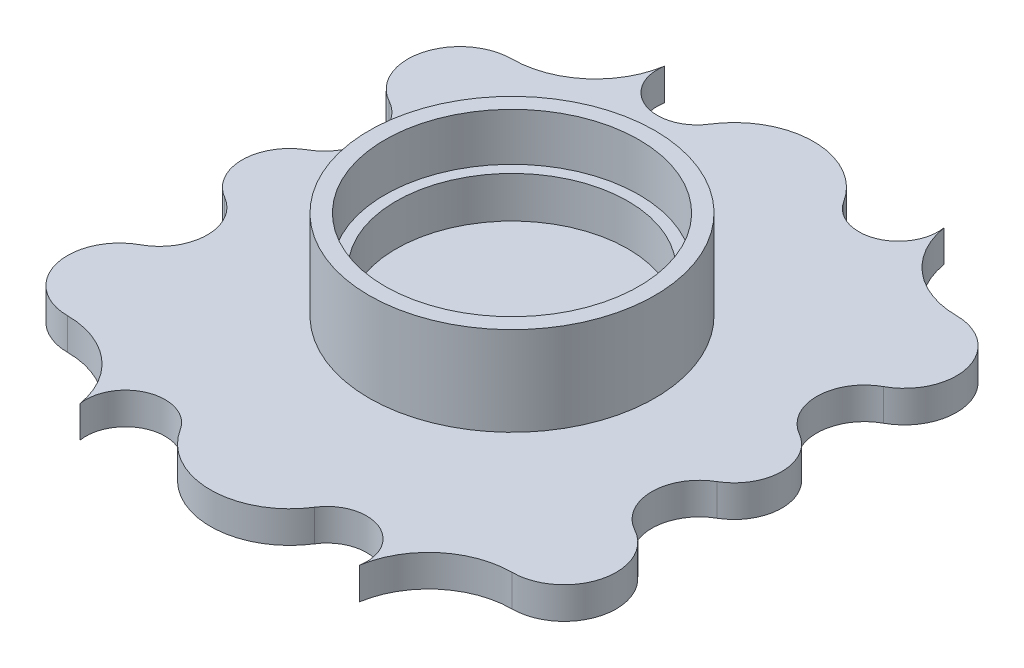
ISO-10303-21;
HEADER;
FILE_DESCRIPTION(('STEP AP214'),'2;1');
FILE_NAME('part.step','',(''),(''),'','','');
FILE_SCHEMA(('AUTOMOTIVE_DESIGN { 1 0 10303 214 1 1 1 1 }'));
ENDSEC;
DATA;
#1=APPLICATION_CONTEXT('core data for automotive mechanical design processes');
#2=APPLICATION_PROTOCOL_DEFINITION('international standard','automotive_design',2000,#1);
#3=PRODUCT_CONTEXT('',#1,'mechanical');
#4=PRODUCT('Part','Part','',(#3));
#5=PRODUCT_RELATED_PRODUCT_CATEGORY('part','',(#4));
#6=PRODUCT_DEFINITION_FORMATION('','',#4);
#7=PRODUCT_DEFINITION_CONTEXT('part definition',#1,'design');
#8=PRODUCT_DEFINITION('design','',#6,#7);
#9=PRODUCT_DEFINITION_SHAPE('','',#8);
#10=(LENGTH_UNIT() NAMED_UNIT(*) SI_UNIT(.MILLI.,.METRE.));
#11=(NAMED_UNIT(*) PLANE_ANGLE_UNIT() SI_UNIT($,.RADIAN.));
#12=(NAMED_UNIT(*) SI_UNIT($,.STERADIAN.) SOLID_ANGLE_UNIT());
#13=UNCERTAINTY_MEASURE_WITH_UNIT(LENGTH_MEASURE(1.E-05),#10,'distance_accuracy_value','');
#14=(GEOMETRIC_REPRESENTATION_CONTEXT(3) GLOBAL_UNCERTAINTY_ASSIGNED_CONTEXT((#13)) GLOBAL_UNIT_ASSIGNED_CONTEXT((#10,
#11,#12)) REPRESENTATION_CONTEXT('',''));
#15=CARTESIAN_POINT('',(0.,0.,0.));
#16=DIRECTION('',(0.,0.,1.));
#17=DIRECTION('',(1.,0.,0.));
#18=AXIS2_PLACEMENT_3D('',#15,#16,#17);
#19=CARTESIAN_POINT('',(70.,10.,-96.2922747821949));
#20=DIRECTION('',(0.,1.,0.));
#21=DIRECTION('',(0.,0.,1.));
#22=AXIS2_PLACEMENT_3D('',#19,#20,#21);
#23=PLANE('',#22);
#24=CARTESIAN_POINT('',(70.,10.,-96.2922747821949));
#25=DIRECTION('',(0.,-1.,0.));
#26=DIRECTION('',(0.,0.,1.));
#27=AXIS2_PLACEMENT_3D('',#24,#25,#26);
#28=CIRCLE('',#27,26.2922747821949);
#29=CARTESIAN_POINT('',(70.,10.,-70.));
#30=VERTEX_POINT('',#29);
#31=CARTESIAN_POINT('',(44.0559087554756,10.,-92.0275540740791));
#32=VERTEX_POINT('',#31);
#33=EDGE_CURVE('E75',#30,#32,#28,.T.);
#34=ORIENTED_EDGE('',*,*,#33,.T.);
#35=CARTESIAN_POINT('',(31.7214438511238,10.,-90.));
#36=DIRECTION('',(0.,-1.,0.));
#37=DIRECTION('',(0.,0.,1.));
#38=AXIS2_PLACEMENT_3D('',#35,#36,#37);
#39=CIRCLE('',#38,12.5);
#40=CARTESIAN_POINT('',(21.1476292340825,10.,-83.3333333333333));
#41=VERTEX_POINT('',#40);
#42=EDGE_CURVE('E128',#32,#41,#39,.T.);
#43=ORIENTED_EDGE('',*,*,#42,.T.);
#44=CARTESIAN_POINT('',(0.,10.,-70.));
#45=DIRECTION('',(0.,1.,0.));
#46=DIRECTION('',(0.,0.,-1.));
#47=AXIS2_PLACEMENT_3D('',#44,#45,#46);
#48=CIRCLE('',#47,25.);
#49=CARTESIAN_POINT('',(-21.1476292340825,10.,-83.3333333333333));
#50=VERTEX_POINT('',#49);
#51=EDGE_CURVE('E274',#41,#50,#48,.T.);
#52=ORIENTED_EDGE('',*,*,#51,.T.);
#53=CARTESIAN_POINT('',(-31.7214438511238,10.,-90.));
#54=DIRECTION('',(0.,-1.,0.));
#55=DIRECTION('',(0.,0.,-1.));
#56=AXIS2_PLACEMENT_3D('',#53,#54,#55);
#57=CIRCLE('',#56,12.5);
#58=CARTESIAN_POINT('',(-44.0559087554755,10.,-92.0275540740791));
#59=VERTEX_POINT('',#58);
#60=EDGE_CURVE('E276',#50,#59,#57,.T.);
#61=ORIENTED_EDGE('',*,*,#60,.T.);
#62=CARTESIAN_POINT('',(-70.,10.,-96.2922747821949));
#63=DIRECTION('',(0.,-1.,0.));
#64=DIRECTION('',(0.,0.,-1.));
#65=AXIS2_PLACEMENT_3D('',#62,#63,#64);
#66=CIRCLE('',#65,26.2922747821949);
#67=CARTESIAN_POINT('',(-70.,10.,-70.));
#68=VERTEX_POINT('',#67);
#69=EDGE_CURVE('E278',#59,#68,#66,.T.);
#70=ORIENTED_EDGE('',*,*,#69,.T.);
#71=CARTESIAN_POINT('',(-70.,10.,-53.5842229288624));
#72=DIRECTION('',(0.,1.,0.));
#73=DIRECTION('',(0.,0.,1.));
#74=AXIS2_PLACEMENT_3D('',#71,#72,#73);
#75=CIRCLE('',#74,16.4157770711376);
#76=CARTESIAN_POINT('',(-77.8379934868232,10.,-39.1605065232405));
#77=VERTEX_POINT('',#76);
#78=EDGE_CURVE('E268',#77,#68,#75,.F.);
#79=ORIENTED_EDGE('',*,*,#78,.F.);
#80=CARTESIAN_POINT('',(-85.,10.,-25.9807621135331));
#81=DIRECTION('',(0.,1.,0.));
#82=DIRECTION('',(0.,0.,1.));
#83=AXIS2_PLACEMENT_3D('',#80,#81,#82);
#84=CIRCLE('',#83,15.);
#85=CARTESIAN_POINT('',(-77.5,10.,-12.9903810567666));
#86=VERTEX_POINT('',#85);
#87=EDGE_CURVE('E250',#77,#86,#84,.F.);
#88=ORIENTED_EDGE('',*,*,#87,.T.);
#89=CARTESIAN_POINT('',(-70.,10.,0.));
#90=DIRECTION('',(0.,1.,0.));
#91=DIRECTION('',(0.,0.,1.));
#92=AXIS2_PLACEMENT_3D('',#89,#90,#91);
#93=CIRCLE('',#92,15.);
#94=CARTESIAN_POINT('',(-77.5,10.,12.9903810567666));
#95=VERTEX_POINT('',#94);
#96=EDGE_CURVE('E332',#95,#86,#93,.F.);
#97=ORIENTED_EDGE('',*,*,#96,.F.);
#98=CARTESIAN_POINT('',(-85.,10.,25.9807621135332));
#99=DIRECTION('',(0.,1.,0.));
#100=DIRECTION('',(0.,0.,1.));
#101=AXIS2_PLACEMENT_3D('',#98,#99,#100);
#102=CIRCLE('',#101,15.);
#103=CARTESIAN_POINT('',(-77.8379934868231,10.,39.1605065232405));
#104=VERTEX_POINT('',#103);
#105=EDGE_CURVE('E323',#104,#95,#102,.T.);
#106=ORIENTED_EDGE('',*,*,#105,.F.);
#107=CARTESIAN_POINT('',(-70.,10.,53.5842229288624));
#108=DIRECTION('',(0.,1.,0.));
#109=DIRECTION('',(0.,0.,1.));
#110=AXIS2_PLACEMENT_3D('',#107,#108,#109);
#111=CIRCLE('',#110,16.4157770711376);
#112=CARTESIAN_POINT('',(-70.,10.,70.));
#113=VERTEX_POINT('',#112);
#114=EDGE_CURVE('E321',#104,#113,#111,.T.);
#115=ORIENTED_EDGE('',*,*,#114,.T.);
#116=CARTESIAN_POINT('',(-70.,10.,96.2922747821949));
#117=DIRECTION('',(0.,-1.,0.));
#118=DIRECTION('',(0.,0.,1.));
#119=AXIS2_PLACEMENT_3D('',#116,#117,#118);
#120=CIRCLE('',#119,26.2922747821949);
#121=CARTESIAN_POINT('',(-44.0559087554755,10.,92.0275540740791));
#122=VERTEX_POINT('',#121);
#123=EDGE_CURVE('E280',#113,#122,#120,.T.);
#124=ORIENTED_EDGE('',*,*,#123,.T.);
#125=CARTESIAN_POINT('',(-31.7214438511238,10.,90.));
#126=DIRECTION('',(0.,-1.,0.));
#127=DIRECTION('',(0.,0.,1.));
#128=AXIS2_PLACEMENT_3D('',#125,#126,#127);
#129=CIRCLE('',#128,12.5);
#130=CARTESIAN_POINT('',(-21.1476292340825,10.,83.3333333333333));
#131=VERTEX_POINT('',#130);
#132=EDGE_CURVE('E282',#122,#131,#129,.T.);
#133=ORIENTED_EDGE('',*,*,#132,.T.);
#134=CARTESIAN_POINT('',(0.,10.,70.));
#135=DIRECTION('',(0.,1.,0.));
#136=DIRECTION('',(0.,0.,1.));
#137=AXIS2_PLACEMENT_3D('',#134,#135,#136);
#138=CIRCLE('',#137,25.);
#139=CARTESIAN_POINT('',(21.1476292340825,10.,83.3333333333333));
#140=VERTEX_POINT('',#139);
#141=EDGE_CURVE('E160',#131,#140,#138,.T.);
#142=ORIENTED_EDGE('',*,*,#141,.T.);
#143=CARTESIAN_POINT('',(31.7214438511238,10.,90.));
#144=DIRECTION('',(0.,-1.,0.));
#145=DIRECTION('',(0.,0.,-1.));
#146=AXIS2_PLACEMENT_3D('',#143,#144,#145);
#147=CIRCLE('',#146,12.5);
#148=CARTESIAN_POINT('',(44.0559087554756,10.,92.0275540740791));
#149=VERTEX_POINT('',#148);
#150=EDGE_CURVE('E154',#140,#149,#147,.T.);
#151=ORIENTED_EDGE('',*,*,#150,.T.);
#152=CARTESIAN_POINT('',(70.,10.,96.2922747821949));
#153=DIRECTION('',(0.,-1.,0.));
#154=DIRECTION('',(0.,0.,-1.));
#155=AXIS2_PLACEMENT_3D('',#152,#153,#154);
#156=CIRCLE('',#155,26.2922747821949);
#157=CARTESIAN_POINT('',(70.,10.,70.));
#158=VERTEX_POINT('',#157);
#159=EDGE_CURVE('E158',#149,#158,#156,.T.);
#160=ORIENTED_EDGE('',*,*,#159,.T.);
#161=CARTESIAN_POINT('',(70.,10.,53.5842229288624));
#162=DIRECTION('',(0.,1.,0.));
#163=DIRECTION('',(0.,0.,1.));
#164=AXIS2_PLACEMENT_3D('',#161,#162,#163);
#165=CIRCLE('',#164,16.4157770711376);
#166=CARTESIAN_POINT('',(77.8379934868232,10.,39.1605065232405));
#167=VERTEX_POINT('',#166);
#168=EDGE_CURVE('E308',#167,#158,#165,.F.);
#169=ORIENTED_EDGE('',*,*,#168,.F.);
#170=CARTESIAN_POINT('',(85.,10.,25.9807621135332));
#171=DIRECTION('',(0.,1.,0.));
#172=DIRECTION('',(0.,0.,1.));
#173=AXIS2_PLACEMENT_3D('',#170,#171,#172);
#174=CIRCLE('',#173,15.);
#175=CARTESIAN_POINT('',(77.5000000000001,10.,12.9903810567666));
#176=VERTEX_POINT('',#175);
#177=EDGE_CURVE('E343',#167,#176,#174,.F.);
#178=ORIENTED_EDGE('',*,*,#177,.T.);
#179=CARTESIAN_POINT('',(70.,10.,0.));
#180=DIRECTION('',(0.,1.,0.));
#181=DIRECTION('',(0.,0.,1.));
#182=AXIS2_PLACEMENT_3D('',#179,#180,#181);
#183=CIRCLE('',#182,15.);
#184=CARTESIAN_POINT('',(77.5,10.,-12.9903810567666));
#185=VERTEX_POINT('',#184);
#186=EDGE_CURVE('E347',#176,#185,#183,.T.);
#187=ORIENTED_EDGE('',*,*,#186,.T.);
#188=CARTESIAN_POINT('',(85.,10.,-25.9807621135332));
#189=DIRECTION('',(0.,1.,0.));
#190=DIRECTION('',(0.,0.,1.));
#191=AXIS2_PLACEMENT_3D('',#188,#189,#190);
#192=CIRCLE('',#191,15.);
#193=CARTESIAN_POINT('',(77.8379934868232,10.,-39.1605065232405));
#194=VERTEX_POINT('',#193);
#195=EDGE_CURVE('E350',#194,#185,#192,.T.);
#196=ORIENTED_EDGE('',*,*,#195,.F.);
#197=CARTESIAN_POINT('',(70.,10.,-53.5842229288624));
#198=DIRECTION('',(0.,1.,0.));
#199=DIRECTION('',(0.,0.,1.));
#200=AXIS2_PLACEMENT_3D('',#197,#198,#199);
#201=CIRCLE('',#200,16.4157770711376);
#202=EDGE_CURVE('E357',#194,#30,#201,.T.);
#203=ORIENTED_EDGE('',*,*,#202,.T.);
#204=EDGE_LOOP('',(#34,#43,#52,#61,#70,#79,#88,#97,#106,#115,#124,#133,#142,#151,#160,#169,#178,
#187,#196,#203));
#205=FACE_BOUND('',#204,.T.);
#206=CARTESIAN_POINT('',(0.,10.,0.));
#207=DIRECTION('',(0.,1.,0.));
#208=DIRECTION('',(0.,0.,1.));
#209=AXIS2_PLACEMENT_3D('',#206,#207,#208);
#210=CIRCLE('',#209,45.);
#211=CARTESIAN_POINT('',(0.,10.,45.));
#212=VERTEX_POINT('',#211);
#213=EDGE_CURVE('E738',#212,#212,#210,.T.);
#214=ORIENTED_EDGE('',*,*,#213,.F.);
#215=EDGE_LOOP('',(#214));
#216=FACE_BOUND('',#215,.T.);
#217=ADVANCED_FACE('F58',(#205,#216),#23,.T.);
#218=CARTESIAN_POINT('',(70.,10.,-96.2922747821949));
#219=DIRECTION('',(0.,-1.,0.));
#220=DIRECTION('',(0.,0.,-1.));
#221=AXIS2_PLACEMENT_3D('',#218,#219,#220);
#222=CYLINDRICAL_SURFACE('',#221,26.2922747821949);
#223=CARTESIAN_POINT('',(70.,0.,-96.2922747821949));
#224=DIRECTION('',(0.,-1.,0.));
#225=DIRECTION('',(0.,0.,1.));
#226=AXIS2_PLACEMENT_3D('',#223,#224,#225);
#227=CIRCLE('',#226,26.2922747821949);
#228=CARTESIAN_POINT('',(70.,0.,-70.));
#229=VERTEX_POINT('',#228);
#230=CARTESIAN_POINT('',(44.0559087554756,0.,-92.0275540740791));
#231=VERTEX_POINT('',#230);
#232=EDGE_CURVE('E176',#229,#231,#227,.T.);
#233=ORIENTED_EDGE('',*,*,#232,.T.);
#234=DIRECTION('',(0.,-1.,0.));
#235=VECTOR('',#234,1.);
#236=CARTESIAN_POINT('',(44.0559087554756,10.,-92.0275540740791));
#237=LINE('',#236,#235);
#238=EDGE_CURVE('E67',#32,#231,#237,.T.);
#239=ORIENTED_EDGE('',*,*,#238,.F.);
#240=ORIENTED_EDGE('',*,*,#33,.F.);
#241=DIRECTION('',(0.,-1.,0.));
#242=VECTOR('',#241,1.);
#243=CARTESIAN_POINT('',(70.,10.,-70.));
#244=LINE('',#243,#242);
#245=EDGE_CURVE('E171',#30,#229,#244,.T.);
#246=ORIENTED_EDGE('',*,*,#245,.T.);
#247=EDGE_LOOP('',(#233,#239,#240,#246));
#248=FACE_BOUND('',#247,.T.);
#249=ADVANCED_FACE('F60',(#248),#222,.F.);
#250=CARTESIAN_POINT('',(31.7214438511238,10.,-90.));
#251=DIRECTION('',(0.,-1.,0.));
#252=DIRECTION('',(0.,0.,-1.));
#253=AXIS2_PLACEMENT_3D('',#250,#251,#252);
#254=CYLINDRICAL_SURFACE('',#253,12.5);
#255=CARTESIAN_POINT('',(31.7214438511238,0.,-90.));
#256=DIRECTION('',(0.,-1.,0.));
#257=DIRECTION('',(0.,0.,1.));
#258=AXIS2_PLACEMENT_3D('',#255,#256,#257);
#259=CIRCLE('',#258,12.5);
#260=CARTESIAN_POINT('',(21.1476292340825,0.,-83.3333333333333));
#261=VERTEX_POINT('',#260);
#262=EDGE_CURVE('E179',#231,#261,#259,.T.);
#263=ORIENTED_EDGE('',*,*,#262,.T.);
#264=DIRECTION('',(0.,-1.,0.));
#265=VECTOR('',#264,1.);
#266=CARTESIAN_POINT('',(21.1476292340825,10.,-83.3333333333333));
#267=LINE('',#266,#265);
#268=EDGE_CURVE('E216',#41,#261,#267,.T.);
#269=ORIENTED_EDGE('',*,*,#268,.F.);
#270=ORIENTED_EDGE('',*,*,#42,.F.);
#271=ORIENTED_EDGE('',*,*,#238,.T.);
#272=EDGE_LOOP('',(#263,#269,#270,#271));
#273=FACE_BOUND('',#272,.T.);
#274=ADVANCED_FACE('F218',(#273),#254,.F.);
#275=CARTESIAN_POINT('',(0.,10.,-70.));
#276=DIRECTION('',(0.,-1.,0.));
#277=DIRECTION('',(0.,0.,-1.));
#278=AXIS2_PLACEMENT_3D('',#275,#276,#277);
#279=CYLINDRICAL_SURFACE('',#278,25.);
#280=CARTESIAN_POINT('',(0.,0.,-70.));
#281=DIRECTION('',(0.,1.,0.));
#282=DIRECTION('',(0.,0.,-1.));
#283=AXIS2_PLACEMENT_3D('',#280,#281,#282);
#284=CIRCLE('',#283,25.);
#285=CARTESIAN_POINT('',(-21.1476292340825,0.,-83.3333333333333));
#286=VERTEX_POINT('',#285);
#287=EDGE_CURVE('E182',#261,#286,#284,.T.);
#288=ORIENTED_EDGE('',*,*,#287,.T.);
#289=DIRECTION('',(0.,-1.,0.));
#290=VECTOR('',#289,1.);
#291=CARTESIAN_POINT('',(-21.1476292340825,10.,-83.3333333333333));
#292=LINE('',#291,#290);
#293=EDGE_CURVE('E213',#50,#286,#292,.T.);
#294=ORIENTED_EDGE('',*,*,#293,.F.);
#295=ORIENTED_EDGE('',*,*,#51,.F.);
#296=ORIENTED_EDGE('',*,*,#268,.T.);
#297=EDGE_LOOP('',(#288,#294,#295,#296));
#298=FACE_BOUND('',#297,.T.);
#299=ADVANCED_FACE('F488',(#298),#279,.T.);
#300=CARTESIAN_POINT('',(-31.7214438511238,10.,-90.));
#301=DIRECTION('',(0.,-1.,0.));
#302=DIRECTION('',(0.,0.,-1.));
#303=AXIS2_PLACEMENT_3D('',#300,#301,#302);
#304=CYLINDRICAL_SURFACE('',#303,12.5);
#305=CARTESIAN_POINT('',(-31.7214438511238,0.,-90.));
#306=DIRECTION('',(0.,-1.,0.));
#307=DIRECTION('',(0.,0.,-1.));
#308=AXIS2_PLACEMENT_3D('',#305,#306,#307);
#309=CIRCLE('',#308,12.5);
#310=CARTESIAN_POINT('',(-44.0559087554755,0.,-92.0275540740791));
#311=VERTEX_POINT('',#310);
#312=EDGE_CURVE('E184',#286,#311,#309,.T.);
#313=ORIENTED_EDGE('',*,*,#312,.T.);
#314=DIRECTION('',(0.,-1.,0.));
#315=VECTOR('',#314,1.);
#316=CARTESIAN_POINT('',(-44.0559087554755,10.,-92.0275540740791));
#317=LINE('',#316,#315);
#318=EDGE_CURVE('E210',#59,#311,#317,.T.);
#319=ORIENTED_EDGE('',*,*,#318,.F.);
#320=ORIENTED_EDGE('',*,*,#60,.F.);
#321=ORIENTED_EDGE('',*,*,#293,.T.);
#322=EDGE_LOOP('',(#313,#319,#320,#321));
#323=FACE_BOUND('',#322,.T.);
#324=ADVANCED_FACE('F484',(#323),#304,.F.);
#325=CARTESIAN_POINT('',(-70.,10.,-96.2922747821949));
#326=DIRECTION('',(0.,-1.,0.));
#327=DIRECTION('',(0.,0.,-1.));
#328=AXIS2_PLACEMENT_3D('',#325,#326,#327);
#329=CYLINDRICAL_SURFACE('',#328,26.2922747821949);
#330=CARTESIAN_POINT('',(-70.,0.,-96.2922747821949));
#331=DIRECTION('',(0.,-1.,0.));
#332=DIRECTION('',(0.,0.,-1.));
#333=AXIS2_PLACEMENT_3D('',#330,#331,#332);
#334=CIRCLE('',#333,26.2922747821949);
#335=CARTESIAN_POINT('',(-70.,0.,-70.));
#336=VERTEX_POINT('',#335);
#337=EDGE_CURVE('E186',#311,#336,#334,.T.);
#338=ORIENTED_EDGE('',*,*,#337,.T.);
#339=DIRECTION('',(0.,-1.,0.));
#340=VECTOR('',#339,1.);
#341=CARTESIAN_POINT('',(-70.,10.,-70.));
#342=LINE('',#341,#340);
#343=EDGE_CURVE('E207',#68,#336,#342,.T.);
#344=ORIENTED_EDGE('',*,*,#343,.F.);
#345=ORIENTED_EDGE('',*,*,#69,.F.);
#346=ORIENTED_EDGE('',*,*,#318,.T.);
#347=EDGE_LOOP('',(#338,#344,#345,#346));
#348=FACE_BOUND('',#347,.T.);
#349=ADVANCED_FACE('F481',(#348),#329,.F.);
#350=CARTESIAN_POINT('',(-70.,10.,96.2922747821949));
#351=DIRECTION('',(0.,-1.,0.));
#352=DIRECTION('',(0.,0.,-1.));
#353=AXIS2_PLACEMENT_3D('',#350,#351,#352);
#354=CYLINDRICAL_SURFACE('',#353,26.2922747821949);
#355=CARTESIAN_POINT('',(-70.,0.,96.2922747821949));
#356=DIRECTION('',(0.,-1.,0.));
#357=DIRECTION('',(0.,0.,1.));
#358=AXIS2_PLACEMENT_3D('',#355,#356,#357);
#359=CIRCLE('',#358,26.2922747821949);
#360=CARTESIAN_POINT('',(-70.,0.,70.));
#361=VERTEX_POINT('',#360);
#362=CARTESIAN_POINT('',(-44.0559087554755,0.,92.0275540740791));
#363=VERTEX_POINT('',#362);
#364=EDGE_CURVE('E188',#361,#363,#359,.T.);
#365=ORIENTED_EDGE('',*,*,#364,.T.);
#366=DIRECTION('',(0.,-1.,0.));
#367=VECTOR('',#366,1.);
#368=CARTESIAN_POINT('',(-44.0559087554755,10.,92.0275540740791));
#369=LINE('',#368,#367);
#370=EDGE_CURVE('E201',#122,#363,#369,.T.);
#371=ORIENTED_EDGE('',*,*,#370,.F.);
#372=ORIENTED_EDGE('',*,*,#123,.F.);
#373=DIRECTION('',(0.,-1.,0.));
#374=VECTOR('',#373,1.);
#375=CARTESIAN_POINT('',(-70.,10.,70.));
#376=LINE('',#375,#374);
#377=EDGE_CURVE('E204',#113,#361,#376,.T.);
#378=ORIENTED_EDGE('',*,*,#377,.T.);
#379=EDGE_LOOP('',(#365,#371,#372,#378));
#380=FACE_BOUND('',#379,.T.);
#381=ADVANCED_FACE('F475',(#380),#354,.F.);
#382=CARTESIAN_POINT('',(-31.7214438511238,10.,90.));
#383=DIRECTION('',(0.,-1.,0.));
#384=DIRECTION('',(0.,0.,-1.));
#385=AXIS2_PLACEMENT_3D('',#382,#383,#384);
#386=CYLINDRICAL_SURFACE('',#385,12.5);
#387=CARTESIAN_POINT('',(-31.7214438511238,0.,90.));
#388=DIRECTION('',(0.,-1.,0.));
#389=DIRECTION('',(0.,0.,1.));
#390=AXIS2_PLACEMENT_3D('',#387,#388,#389);
#391=CIRCLE('',#390,12.5);
#392=CARTESIAN_POINT('',(-21.1476292340825,0.,83.3333333333333));
#393=VERTEX_POINT('',#392);
#394=EDGE_CURVE('E190',#363,#393,#391,.T.);
#395=ORIENTED_EDGE('',*,*,#394,.T.);
#396=DIRECTION('',(0.,-1.,0.));
#397=VECTOR('',#396,1.);
#398=CARTESIAN_POINT('',(-21.1476292340825,10.,83.3333333333333));
#399=LINE('',#398,#397);
#400=EDGE_CURVE('E198',#131,#393,#399,.T.);
#401=ORIENTED_EDGE('',*,*,#400,.F.);
#402=ORIENTED_EDGE('',*,*,#132,.F.);
#403=ORIENTED_EDGE('',*,*,#370,.T.);
#404=EDGE_LOOP('',(#395,#401,#402,#403));
#405=FACE_BOUND('',#404,.T.);
#406=ADVANCED_FACE('F289',(#405),#386,.F.);
#407=CARTESIAN_POINT('',(0.,10.,70.));
#408=DIRECTION('',(0.,-1.,0.));
#409=DIRECTION('',(0.,0.,-1.));
#410=AXIS2_PLACEMENT_3D('',#407,#408,#409);
#411=CYLINDRICAL_SURFACE('',#410,25.);
#412=CARTESIAN_POINT('',(0.,0.,70.));
#413=DIRECTION('',(0.,1.,0.));
#414=DIRECTION('',(0.,0.,1.));
#415=AXIS2_PLACEMENT_3D('',#412,#413,#414);
#416=CIRCLE('',#415,25.);
#417=CARTESIAN_POINT('',(21.1476292340825,0.,83.3333333333333));
#418=VERTEX_POINT('',#417);
#419=EDGE_CURVE('E192',#393,#418,#416,.T.);
#420=ORIENTED_EDGE('',*,*,#419,.T.);
#421=DIRECTION('',(0.,-1.,0.));
#422=VECTOR('',#421,1.);
#423=CARTESIAN_POINT('',(21.1476292340825,10.,83.3333333333333));
#424=LINE('',#423,#422);
#425=EDGE_CURVE('E165',#140,#418,#424,.T.);
#426=ORIENTED_EDGE('',*,*,#425,.F.);
#427=ORIENTED_EDGE('',*,*,#141,.F.);
#428=ORIENTED_EDGE('',*,*,#400,.T.);
#429=EDGE_LOOP('',(#420,#426,#427,#428));
#430=FACE_BOUND('',#429,.T.);
#431=ADVANCED_FACE('F293',(#430),#411,.T.);
#432=CARTESIAN_POINT('',(31.7214438511238,10.,90.));
#433=DIRECTION('',(0.,-1.,0.));
#434=DIRECTION('',(0.,0.,-1.));
#435=AXIS2_PLACEMENT_3D('',#432,#433,#434);
#436=CYLINDRICAL_SURFACE('',#435,12.5);
#437=CARTESIAN_POINT('',(31.7214438511238,0.,90.));
#438=DIRECTION('',(0.,-1.,0.));
#439=DIRECTION('',(0.,0.,-1.));
#440=AXIS2_PLACEMENT_3D('',#437,#438,#439);
#441=CIRCLE('',#440,12.5);
#442=CARTESIAN_POINT('',(44.0559087554756,0.,92.0275540740791));
#443=VERTEX_POINT('',#442);
#444=EDGE_CURVE('E112',#418,#443,#441,.T.);
#445=ORIENTED_EDGE('',*,*,#444,.T.);
#446=DIRECTION('',(0.,-1.,0.));
#447=VECTOR('',#446,1.);
#448=CARTESIAN_POINT('',(44.0559087554756,10.,92.0275540740791));
#449=LINE('',#448,#447);
#450=EDGE_CURVE('E163',#149,#443,#449,.T.);
#451=ORIENTED_EDGE('',*,*,#450,.F.);
#452=ORIENTED_EDGE('',*,*,#150,.F.);
#453=ORIENTED_EDGE('',*,*,#425,.T.);
#454=EDGE_LOOP('',(#445,#451,#452,#453));
#455=FACE_BOUND('',#454,.T.);
#456=ADVANCED_FACE('F164',(#455),#436,.F.);
#457=CARTESIAN_POINT('',(70.,10.,96.2922747821949));
#458=DIRECTION('',(0.,-1.,0.));
#459=DIRECTION('',(0.,0.,-1.));
#460=AXIS2_PLACEMENT_3D('',#457,#458,#459);
#461=CYLINDRICAL_SURFACE('',#460,26.2922747821949);
#462=CARTESIAN_POINT('',(70.,0.,96.2922747821949));
#463=DIRECTION('',(0.,-1.,0.));
#464=DIRECTION('',(0.,0.,-1.));
#465=AXIS2_PLACEMENT_3D('',#462,#463,#464);
#466=CIRCLE('',#465,26.2922747821949);
#467=CARTESIAN_POINT('',(70.,0.,70.));
#468=VERTEX_POINT('',#467);
#469=EDGE_CURVE('E119',#443,#468,#466,.T.);
#470=ORIENTED_EDGE('',*,*,#469,.T.);
#471=DIRECTION('',(0.,-1.,0.));
#472=VECTOR('',#471,1.);
#473=CARTESIAN_POINT('',(70.,10.,70.));
#474=LINE('',#473,#472);
#475=EDGE_CURVE('E166',#158,#468,#474,.T.);
#476=ORIENTED_EDGE('',*,*,#475,.F.);
#477=ORIENTED_EDGE('',*,*,#159,.F.);
#478=ORIENTED_EDGE('',*,*,#450,.T.);
#479=EDGE_LOOP('',(#470,#476,#477,#478));
#480=FACE_BOUND('',#479,.T.);
#481=ADVANCED_FACE('F168',(#480),#461,.F.);
#482=CARTESIAN_POINT('',(70.,0.,-96.2922747821949));
#483=DIRECTION('',(0.,1.,0.));
#484=DIRECTION('',(0.,0.,1.));
#485=AXIS2_PLACEMENT_3D('',#482,#483,#484);
#486=PLANE('',#485);
#487=ORIENTED_EDGE('',*,*,#232,.F.);
#488=CARTESIAN_POINT('',(70.,0.,-53.5842229288624));
#489=DIRECTION('',(0.,1.,0.));
#490=DIRECTION('',(0.,0.,1.));
#491=AXIS2_PLACEMENT_3D('',#488,#489,#490);
#492=CIRCLE('',#491,16.4157770711376);
#493=CARTESIAN_POINT('',(77.8379934868232,0.,-39.1605065232405));
#494=VERTEX_POINT('',#493);
#495=EDGE_CURVE('E227',#494,#229,#492,.T.);
#496=ORIENTED_EDGE('',*,*,#495,.F.);
#497=CARTESIAN_POINT('',(85.,0.,-25.9807621135332));
#498=DIRECTION('',(0.,1.,0.));
#499=DIRECTION('',(0.,0.,1.));
#500=AXIS2_PLACEMENT_3D('',#497,#498,#499);
#501=CIRCLE('',#500,15.);
#502=CARTESIAN_POINT('',(77.5,0.,-12.9903810567666));
#503=VERTEX_POINT('',#502);
#504=EDGE_CURVE('E355',#494,#503,#501,.T.);
#505=ORIENTED_EDGE('',*,*,#504,.T.);
#506=CARTESIAN_POINT('',(70.,0.,0.));
#507=DIRECTION('',(0.,1.,0.));
#508=DIRECTION('',(0.,0.,1.));
#509=AXIS2_PLACEMENT_3D('',#506,#507,#508);
#510=CIRCLE('',#509,15.);
#511=CARTESIAN_POINT('',(77.5000000000001,0.,12.9903810567666));
#512=VERTEX_POINT('',#511);
#513=EDGE_CURVE('E339',#512,#503,#510,.T.);
#514=ORIENTED_EDGE('',*,*,#513,.F.);
#515=CARTESIAN_POINT('',(85.,0.,25.9807621135332));
#516=DIRECTION('',(0.,1.,0.));
#517=DIRECTION('',(0.,0.,1.));
#518=AXIS2_PLACEMENT_3D('',#515,#516,#517);
#519=CIRCLE('',#518,15.);
#520=CARTESIAN_POINT('',(77.8379934868232,0.,39.1605065232405));
#521=VERTEX_POINT('',#520);
#522=EDGE_CURVE('E300',#521,#512,#519,.F.);
#523=ORIENTED_EDGE('',*,*,#522,.F.);
#524=CARTESIAN_POINT('',(70.,0.,53.5842229288624));
#525=DIRECTION('',(0.,1.,0.));
#526=DIRECTION('',(0.,0.,1.));
#527=AXIS2_PLACEMENT_3D('',#524,#525,#526);
#528=CIRCLE('',#527,16.4157770711376);
#529=EDGE_CURVE('E296',#521,#468,#528,.F.);
#530=ORIENTED_EDGE('',*,*,#529,.T.);
#531=ORIENTED_EDGE('',*,*,#469,.F.);
#532=ORIENTED_EDGE('',*,*,#444,.F.);
#533=ORIENTED_EDGE('',*,*,#419,.F.);
#534=ORIENTED_EDGE('',*,*,#394,.F.);
#535=ORIENTED_EDGE('',*,*,#364,.F.);
#536=CARTESIAN_POINT('',(-70.,0.,53.5842229288624));
#537=DIRECTION('',(0.,1.,0.));
#538=DIRECTION('',(0.,0.,1.));
#539=AXIS2_PLACEMENT_3D('',#536,#537,#538);
#540=CIRCLE('',#539,16.4157770711376);
#541=CARTESIAN_POINT('',(-77.8379934868231,0.,39.1605065232405));
#542=VERTEX_POINT('',#541);
#543=EDGE_CURVE('E320',#542,#361,#540,.T.);
#544=ORIENTED_EDGE('',*,*,#543,.F.);
#545=CARTESIAN_POINT('',(-85.,0.,25.9807621135332));
#546=DIRECTION('',(0.,1.,0.));
#547=DIRECTION('',(0.,0.,1.));
#548=AXIS2_PLACEMENT_3D('',#545,#546,#547);
#549=CIRCLE('',#548,15.);
#550=CARTESIAN_POINT('',(-77.5,0.,12.9903810567666));
#551=VERTEX_POINT('',#550);
#552=EDGE_CURVE('E328',#542,#551,#549,.T.);
#553=ORIENTED_EDGE('',*,*,#552,.T.);
#554=CARTESIAN_POINT('',(-70.,0.,0.));
#555=DIRECTION('',(0.,1.,0.));
#556=DIRECTION('',(0.,0.,1.));
#557=AXIS2_PLACEMENT_3D('',#554,#555,#556);
#558=CIRCLE('',#557,15.);
#559=CARTESIAN_POINT('',(-77.5,0.,-12.9903810567666));
#560=VERTEX_POINT('',#559);
#561=EDGE_CURVE('E263',#551,#560,#558,.F.);
#562=ORIENTED_EDGE('',*,*,#561,.T.);
#563=CARTESIAN_POINT('',(-85.,0.,-25.9807621135331));
#564=DIRECTION('',(0.,1.,0.));
#565=DIRECTION('',(0.,0.,1.));
#566=AXIS2_PLACEMENT_3D('',#563,#564,#565);
#567=CIRCLE('',#566,15.);
#568=CARTESIAN_POINT('',(-77.8379934868232,0.,-39.1605065232405));
#569=VERTEX_POINT('',#568);
#570=EDGE_CURVE('E247',#569,#560,#567,.F.);
#571=ORIENTED_EDGE('',*,*,#570,.F.);
#572=CARTESIAN_POINT('',(-70.,0.,-53.5842229288624));
#573=DIRECTION('',(0.,1.,0.));
#574=DIRECTION('',(0.,0.,1.));
#575=AXIS2_PLACEMENT_3D('',#572,#573,#574);
#576=CIRCLE('',#575,16.4157770711376);
#577=EDGE_CURVE('E256',#569,#336,#576,.F.);
#578=ORIENTED_EDGE('',*,*,#577,.T.);
#579=ORIENTED_EDGE('',*,*,#337,.F.);
#580=ORIENTED_EDGE('',*,*,#312,.F.);
#581=ORIENTED_EDGE('',*,*,#287,.F.);
#582=ORIENTED_EDGE('',*,*,#262,.F.);
#583=EDGE_LOOP('',(#487,#496,#505,#514,#523,#530,#531,#532,#533,#534,#535,#544,#553,#562,#571,
#578,#579,#580,#581,#582));
#584=FACE_BOUND('',#583,.T.);
#585=ADVANCED_FACE('F224',(#584),#486,.F.);
#586=CARTESIAN_POINT('',(-70.,0.,-53.5842229288624));
#587=DIRECTION('',(0.,1.,0.));
#588=DIRECTION('',(0.,0.,1.));
#589=AXIS2_PLACEMENT_3D('',#586,#587,#588);
#590=CYLINDRICAL_SURFACE('',#589,16.4157770711376);
#591=ORIENTED_EDGE('',*,*,#78,.T.);
#592=ORIENTED_EDGE('',*,*,#343,.T.);
#593=ORIENTED_EDGE('',*,*,#577,.F.);
#594=DIRECTION('',(0.,1.,0.));
#595=VECTOR('',#594,1.);
#596=CARTESIAN_POINT('',(-77.8379934868232,0.,-39.1605065232405));
#597=LINE('',#596,#595);
#598=EDGE_CURVE('E180',#569,#77,#597,.T.);
#599=ORIENTED_EDGE('',*,*,#598,.T.);
#600=EDGE_LOOP('',(#591,#592,#593,#599));
#601=FACE_BOUND('',#600,.T.);
#602=ADVANCED_FACE('F257',(#601),#590,.T.);
#603=CARTESIAN_POINT('',(-85.,0.,-25.9807621135331));
#604=DIRECTION('',(0.,1.,0.));
#605=DIRECTION('',(0.,0.,1.));
#606=AXIS2_PLACEMENT_3D('',#603,#604,#605);
#607=CYLINDRICAL_SURFACE('',#606,15.);
#608=ORIENTED_EDGE('',*,*,#87,.F.);
#609=ORIENTED_EDGE('',*,*,#598,.F.);
#610=ORIENTED_EDGE('',*,*,#570,.T.);
#611=DIRECTION('',(0.,1.,0.));
#612=VECTOR('',#611,1.);
#613=CARTESIAN_POINT('',(-77.5,0.,-12.9903810567666));
#614=LINE('',#613,#612);
#615=EDGE_CURVE('E326',#560,#86,#614,.T.);
#616=ORIENTED_EDGE('',*,*,#615,.T.);
#617=EDGE_LOOP('',(#608,#609,#610,#616));
#618=FACE_BOUND('',#617,.T.);
#619=ADVANCED_FACE('F243',(#618),#607,.F.);
#620=CARTESIAN_POINT('',(85.,0.,-25.9807621135332));
#621=DIRECTION('',(0.,1.,0.));
#622=DIRECTION('',(0.,0.,1.));
#623=AXIS2_PLACEMENT_3D('',#620,#621,#622);
#624=CYLINDRICAL_SURFACE('',#623,15.);
#625=ORIENTED_EDGE('',*,*,#195,.T.);
#626=DIRECTION('',(0.,1.,0.));
#627=VECTOR('',#626,1.);
#628=CARTESIAN_POINT('',(77.5,0.,-12.9903810567666));
#629=LINE('',#628,#627);
#630=EDGE_CURVE('E344',#503,#185,#629,.T.);
#631=ORIENTED_EDGE('',*,*,#630,.F.);
#632=ORIENTED_EDGE('',*,*,#504,.F.);
#633=DIRECTION('',(0.,1.,0.));
#634=VECTOR('',#633,1.);
#635=CARTESIAN_POINT('',(77.8379934868232,0.,-39.1605065232405));
#636=LINE('',#635,#634);
#637=EDGE_CURVE('E270',#494,#194,#636,.T.);
#638=ORIENTED_EDGE('',*,*,#637,.T.);
#639=EDGE_LOOP('',(#625,#631,#632,#638));
#640=FACE_BOUND('',#639,.T.);
#641=ADVANCED_FACE('F365',(#640),#624,.F.);
#642=CARTESIAN_POINT('',(70.,0.,-53.5842229288624));
#643=DIRECTION('',(0.,1.,0.));
#644=DIRECTION('',(0.,0.,1.));
#645=AXIS2_PLACEMENT_3D('',#642,#643,#644);
#646=CYLINDRICAL_SURFACE('',#645,16.4157770711376);
#647=ORIENTED_EDGE('',*,*,#202,.F.);
#648=ORIENTED_EDGE('',*,*,#637,.F.);
#649=ORIENTED_EDGE('',*,*,#495,.T.);
#650=ORIENTED_EDGE('',*,*,#245,.F.);
#651=EDGE_LOOP('',(#647,#648,#649,#650));
#652=FACE_BOUND('',#651,.T.);
#653=ADVANCED_FACE('F371',(#652),#646,.T.);
#654=CARTESIAN_POINT('',(70.,0.,0.));
#655=DIRECTION('',(0.,1.,0.));
#656=DIRECTION('',(0.,0.,1.));
#657=AXIS2_PLACEMENT_3D('',#654,#655,#656);
#658=CYLINDRICAL_SURFACE('',#657,15.);
#659=ORIENTED_EDGE('',*,*,#186,.F.);
#660=DIRECTION('',(0.,1.,0.));
#661=VECTOR('',#660,1.);
#662=CARTESIAN_POINT('',(77.5000000000001,0.,12.9903810567666));
#663=LINE('',#662,#661);
#664=EDGE_CURVE('E340',#512,#176,#663,.T.);
#665=ORIENTED_EDGE('',*,*,#664,.F.);
#666=ORIENTED_EDGE('',*,*,#513,.T.);
#667=ORIENTED_EDGE('',*,*,#630,.T.);
#668=EDGE_LOOP('',(#659,#665,#666,#667));
#669=FACE_BOUND('',#668,.T.);
#670=ADVANCED_FACE('F373',(#669),#658,.T.);
#671=CARTESIAN_POINT('',(85.,0.,25.9807621135332));
#672=DIRECTION('',(0.,1.,0.));
#673=DIRECTION('',(0.,0.,1.));
#674=AXIS2_PLACEMENT_3D('',#671,#672,#673);
#675=CYLINDRICAL_SURFACE('',#674,15.);
#676=ORIENTED_EDGE('',*,*,#177,.F.);
#677=DIRECTION('',(0.,1.,0.));
#678=VECTOR('',#677,1.);
#679=CARTESIAN_POINT('',(77.8379934868232,0.,39.1605065232405));
#680=LINE('',#679,#678);
#681=EDGE_CURVE('E305',#521,#167,#680,.T.);
#682=ORIENTED_EDGE('',*,*,#681,.F.);
#683=ORIENTED_EDGE('',*,*,#522,.T.);
#684=ORIENTED_EDGE('',*,*,#664,.T.);
#685=EDGE_LOOP('',(#676,#682,#683,#684));
#686=FACE_BOUND('',#685,.T.);
#687=ADVANCED_FACE('F379',(#686),#675,.F.);
#688=CARTESIAN_POINT('',(-85.,0.,25.9807621135332));
#689=DIRECTION('',(0.,1.,0.));
#690=DIRECTION('',(0.,0.,1.));
#691=AXIS2_PLACEMENT_3D('',#688,#689,#690);
#692=CYLINDRICAL_SURFACE('',#691,15.);
#693=ORIENTED_EDGE('',*,*,#105,.T.);
#694=DIRECTION('',(0.,1.,0.));
#695=VECTOR('',#694,1.);
#696=CARTESIAN_POINT('',(-77.5,0.,12.9903810567666));
#697=LINE('',#696,#695);
#698=EDGE_CURVE('E329',#551,#95,#697,.T.);
#699=ORIENTED_EDGE('',*,*,#698,.F.);
#700=ORIENTED_EDGE('',*,*,#552,.F.);
#701=DIRECTION('',(0.,1.,0.));
#702=VECTOR('',#701,1.);
#703=CARTESIAN_POINT('',(-77.8379934868231,0.,39.1605065232405));
#704=LINE('',#703,#702);
#705=EDGE_CURVE('E304',#542,#104,#704,.T.);
#706=ORIENTED_EDGE('',*,*,#705,.T.);
#707=EDGE_LOOP('',(#693,#699,#700,#706));
#708=FACE_BOUND('',#707,.T.);
#709=ADVANCED_FACE('F433',(#708),#692,.F.);
#710=CARTESIAN_POINT('',(-70.,0.,0.));
#711=DIRECTION('',(0.,1.,0.));
#712=DIRECTION('',(0.,0.,1.));
#713=AXIS2_PLACEMENT_3D('',#710,#711,#712);
#714=CYLINDRICAL_SURFACE('',#713,15.);
#715=ORIENTED_EDGE('',*,*,#96,.T.);
#716=ORIENTED_EDGE('',*,*,#615,.F.);
#717=ORIENTED_EDGE('',*,*,#561,.F.);
#718=ORIENTED_EDGE('',*,*,#698,.T.);
#719=EDGE_LOOP('',(#715,#716,#717,#718));
#720=FACE_BOUND('',#719,.T.);
#721=ADVANCED_FACE('F429',(#720),#714,.T.);
#722=CARTESIAN_POINT('',(-70.,0.,53.5842229288624));
#723=DIRECTION('',(0.,1.,0.));
#724=DIRECTION('',(0.,0.,1.));
#725=AXIS2_PLACEMENT_3D('',#722,#723,#724);
#726=CYLINDRICAL_SURFACE('',#725,16.4157770711376);
#727=ORIENTED_EDGE('',*,*,#114,.F.);
#728=ORIENTED_EDGE('',*,*,#705,.F.);
#729=ORIENTED_EDGE('',*,*,#543,.T.);
#730=ORIENTED_EDGE('',*,*,#377,.F.);
#731=EDGE_LOOP('',(#727,#728,#729,#730));
#732=FACE_BOUND('',#731,.T.);
#733=ADVANCED_FACE('F426',(#732),#726,.T.);
#734=CARTESIAN_POINT('',(70.,0.,53.5842229288624));
#735=DIRECTION('',(0.,1.,0.));
#736=DIRECTION('',(0.,0.,1.));
#737=AXIS2_PLACEMENT_3D('',#734,#735,#736);
#738=CYLINDRICAL_SURFACE('',#737,16.4157770711376);
#739=ORIENTED_EDGE('',*,*,#168,.T.);
#740=ORIENTED_EDGE('',*,*,#475,.T.);
#741=ORIENTED_EDGE('',*,*,#529,.F.);
#742=ORIENTED_EDGE('',*,*,#681,.T.);
#743=EDGE_LOOP('',(#739,#740,#741,#742));
#744=FACE_BOUND('',#743,.T.);
#745=ADVANCED_FACE('F307',(#744),#738,.T.);
#746=CARTESIAN_POINT('',(0.,38.,0.));
#747=DIRECTION('',(0.,1.,0.));
#748=DIRECTION('',(0.,0.,1.));
#749=AXIS2_PLACEMENT_3D('',#746,#747,#748);
#750=PLANE('',#749);
#751=CARTESIAN_POINT('',(0.,38.,0.));
#752=DIRECTION('',(0.,1.,0.));
#753=DIRECTION('',(0.,0.,1.));
#754=AXIS2_PLACEMENT_3D('',#751,#752,#753);
#755=CIRCLE('',#754,45.);
#756=CARTESIAN_POINT('',(0.,38.,45.));
#757=VERTEX_POINT('',#756);
#758=EDGE_CURVE('E735',#757,#757,#755,.T.);
#759=ORIENTED_EDGE('',*,*,#758,.T.);
#760=EDGE_LOOP('',(#759));
#761=FACE_BOUND('',#760,.T.);
#762=CARTESIAN_POINT('',(0.,38.,0.));
#763=DIRECTION('',(0.,1.,0.));
#764=DIRECTION('',(0.,0.,1.));
#765=AXIS2_PLACEMENT_3D('',#762,#763,#764);
#766=CIRCLE('',#765,40.);
#767=CARTESIAN_POINT('',(0.,38.,40.));
#768=VERTEX_POINT('',#767);
#769=EDGE_CURVE('E742',#768,#768,#766,.T.);
#770=ORIENTED_EDGE('',*,*,#769,.F.);
#771=EDGE_LOOP('',(#770));
#772=FACE_BOUND('',#771,.T.);
#773=ADVANCED_FACE('F412',(#761,#772),#750,.T.);
#774=CARTESIAN_POINT('',(0.,38.,0.));
#775=DIRECTION('',(0.,-1.,0.));
#776=DIRECTION('',(0.,0.,-1.));
#777=AXIS2_PLACEMENT_3D('',#774,#775,#776);
#778=CYLINDRICAL_SURFACE('',#777,45.);
#779=ORIENTED_EDGE('',*,*,#758,.F.);
#780=EDGE_LOOP('',(#779));
#781=FACE_BOUND('',#780,.T.);
#782=ORIENTED_EDGE('',*,*,#213,.T.);
#783=EDGE_LOOP('',(#782));
#784=FACE_BOUND('',#783,.T.);
#785=ADVANCED_FACE('F404',(#781,#784),#778,.T.);
#786=CARTESIAN_POINT('',(0.,38.,0.));
#787=DIRECTION('',(0.,-1.,0.));
#788=DIRECTION('',(0.,0.,-1.));
#789=AXIS2_PLACEMENT_3D('',#786,#787,#788);
#790=CYLINDRICAL_SURFACE('',#789,40.);
#791=CARTESIAN_POINT('',(0.,23.,0.));
#792=DIRECTION('',(0.,1.,0.));
#793=DIRECTION('',(0.,0.,1.));
#794=AXIS2_PLACEMENT_3D('',#791,#792,#793);
#795=CIRCLE('',#794,40.);
#796=CARTESIAN_POINT('',(0.,23.,40.));
#797=VERTEX_POINT('',#796);
#798=EDGE_CURVE('E315',#797,#797,#795,.F.);
#799=ORIENTED_EDGE('',*,*,#798,.T.);
#800=EDGE_LOOP('',(#799));
#801=FACE_BOUND('',#800,.T.);
#802=ORIENTED_EDGE('',*,*,#769,.T.);
#803=EDGE_LOOP('',(#802));
#804=FACE_BOUND('',#803,.T.);
#805=ADVANCED_FACE('F394',(#801,#804),#790,.F.);
#806=CARTESIAN_POINT('',(0.,10.,0.));
#807=DIRECTION('',(0.,1.,0.));
#808=DIRECTION('',(0.,0.,1.));
#809=AXIS2_PLACEMENT_3D('',#806,#807,#808);
#810=CIRCLE('',#809,36.5);
#811=CARTESIAN_POINT('',(0.,10.,-36.5));
#812=VERTEX_POINT('',#811);
#813=EDGE_CURVE('E12',#812,#812,#810,.F.);
#814=ORIENTED_EDGE('',*,*,#813,.F.);
#815=EDGE_LOOP('',(#814));
#816=FACE_BOUND('',#815,.T.);
#817=ADVANCED_FACE('F385',(#816),#23,.T.);
#818=CARTESIAN_POINT('',(0.,23.,0.));
#819=DIRECTION('',(0.,-1.,0.));
#820=DIRECTION('',(0.,0.,-1.));
#821=AXIS2_PLACEMENT_3D('',#818,#819,#820);
#822=CYLINDRICAL_SURFACE('',#821,36.5);
#823=CARTESIAN_POINT('',(0.,23.,0.));
#824=DIRECTION('',(0.,1.,0.));
#825=DIRECTION('',(0.,0.,1.));
#826=AXIS2_PLACEMENT_3D('',#823,#824,#825);
#827=CIRCLE('',#826,36.5);
#828=CARTESIAN_POINT('',(0.,23.,-36.5));
#829=VERTEX_POINT('',#828);
#830=EDGE_CURVE('E311',#829,#829,#827,.T.);
#831=CARTESIAN_POINT('',(0.,23.,-36.5));
#832=CARTESIAN_POINT('',(0.,22.8645833333333,-36.5));
#833=CARTESIAN_POINT('',(0.,22.7291666666667,-36.5));
#834=CARTESIAN_POINT('',(0.,22.4583333333333,-36.5));
#835=CARTESIAN_POINT('',(0.,22.3229166666667,-36.5));
#836=CARTESIAN_POINT('',(0.,22.0520833333333,-36.5));
#837=CARTESIAN_POINT('',(0.,21.9166666666667,-36.5));
#838=CARTESIAN_POINT('',(0.,21.6458333333333,-36.5));
#839=CARTESIAN_POINT('',(0.,21.5104166666667,-36.5));
#840=CARTESIAN_POINT('',(0.,21.2395833333333,-36.5));
#841=CARTESIAN_POINT('',(0.,21.1041666666667,-36.5));
#842=CARTESIAN_POINT('',(0.,20.8333333333333,-36.5));
#843=CARTESIAN_POINT('',(0.,20.6979166666667,-36.5));
#844=CARTESIAN_POINT('',(0.,20.4270833333333,-36.5));
#845=CARTESIAN_POINT('',(0.,20.2916666666667,-36.5));
#846=CARTESIAN_POINT('',(0.,20.0208333333333,-36.5));
#847=CARTESIAN_POINT('',(0.,19.8854166666667,-36.5));
#848=CARTESIAN_POINT('',(0.,19.6145833333333,-36.5));
#849=CARTESIAN_POINT('',(0.,19.4791666666667,-36.5));
#850=CARTESIAN_POINT('',(0.,19.2083333333333,-36.5));
#851=CARTESIAN_POINT('',(0.,19.0729166666667,-36.5));
#852=CARTESIAN_POINT('',(0.,18.8020833333333,-36.5));
#853=CARTESIAN_POINT('',(0.,18.6666666666667,-36.5));
#854=CARTESIAN_POINT('',(0.,18.3958333333333,-36.5));
#855=CARTESIAN_POINT('',(0.,18.2604166666667,-36.5));
#856=CARTESIAN_POINT('',(0.,17.9895833333333,-36.5));
#857=CARTESIAN_POINT('',(0.,17.8541666666667,-36.5));
#858=CARTESIAN_POINT('',(0.,17.5833333333333,-36.5));
#859=CARTESIAN_POINT('',(0.,17.4479166666667,-36.5));
#860=CARTESIAN_POINT('',(0.,17.1770833333333,-36.5));
#861=CARTESIAN_POINT('',(0.,17.0416666666667,-36.5));
#862=CARTESIAN_POINT('',(0.,16.7708333333333,-36.5));
#863=CARTESIAN_POINT('',(0.,16.6354166666667,-36.5));
#864=CARTESIAN_POINT('',(0.,16.3645833333333,-36.5));
#865=CARTESIAN_POINT('',(0.,16.2291666666667,-36.5));
#866=CARTESIAN_POINT('',(0.,15.9583333333333,-36.5));
#867=CARTESIAN_POINT('',(0.,15.8229166666667,-36.5));
#868=CARTESIAN_POINT('',(0.,15.5520833333333,-36.5));
#869=CARTESIAN_POINT('',(0.,15.4166666666667,-36.5));
#870=CARTESIAN_POINT('',(0.,15.1458333333333,-36.5));
#871=CARTESIAN_POINT('',(0.,15.0104166666667,-36.5));
#872=CARTESIAN_POINT('',(0.,14.7395833333333,-36.5));
#873=CARTESIAN_POINT('',(0.,14.6041666666667,-36.5));
#874=CARTESIAN_POINT('',(0.,14.3333333333333,-36.5));
#875=CARTESIAN_POINT('',(0.,14.1979166666667,-36.5));
#876=CARTESIAN_POINT('',(0.,13.9270833333333,-36.5));
#877=CARTESIAN_POINT('',(0.,13.7916666666667,-36.5));
#878=CARTESIAN_POINT('',(0.,13.5208333333333,-36.5));
#879=CARTESIAN_POINT('',(0.,13.3854166666667,-36.5));
#880=CARTESIAN_POINT('',(0.,13.1145833333333,-36.5));
#881=CARTESIAN_POINT('',(0.,12.9791666666667,-36.5));
#882=CARTESIAN_POINT('',(0.,12.7083333333333,-36.5));
#883=CARTESIAN_POINT('',(0.,12.5729166666667,-36.5));
#884=CARTESIAN_POINT('',(0.,12.3020833333333,-36.5));
#885=CARTESIAN_POINT('',(0.,12.1666666666667,-36.5));
#886=CARTESIAN_POINT('',(0.,11.8958333333333,-36.5));
#887=CARTESIAN_POINT('',(0.,11.7604166666667,-36.5));
#888=CARTESIAN_POINT('',(0.,11.4895833333333,-36.5));
#889=CARTESIAN_POINT('',(0.,11.3541666666667,-36.5));
#890=CARTESIAN_POINT('',(0.,11.0833333333333,-36.5));
#891=CARTESIAN_POINT('',(0.,10.9479166666667,-36.5));
#892=CARTESIAN_POINT('',(0.,10.6770833333333,-36.5));
#893=CARTESIAN_POINT('',(0.,10.5416666666667,-36.5));
#894=CARTESIAN_POINT('',(0.,10.2708333333333,-36.5));
#895=CARTESIAN_POINT('',(0.,10.1354166666667,-36.5));
#896=CARTESIAN_POINT('',(0.,10.,-36.5));
#897=B_SPLINE_CURVE_WITH_KNOTS('',3,(#831,#832,#833,#834,#835,#836,#837,#838,#839,#840,#841,
#842,#843,#844,#845,#846,#847,#848,#849,#850,#851,#852,#853,#854,#855,#856,#857,#858,#859,#860,
#861,#862,#863,#864,#865,#866,#867,#868,#869,#870,#871,#872,#873,#874,#875,#876,#877,#878,#879,
#880,#881,#882,#883,#884,#885,#886,#887,#888,#889,#890,#891,#892,#893,#894,#895,#896),
.UNSPECIFIED.,.F.,.F.,(4,2,2,2,2,2,2,2,2,2,2,2,2,2,2,2,2,2,2,2,2,2,2,2,2,2,2,2,2,2,2,2,4),(0.,
0.40625,0.812500000000001,1.21875,1.625,2.03125,2.4375,2.84375,3.25,3.65625,4.0625,4.46875,
4.875,5.28125,5.6875,6.09375,6.5,6.90625,7.3125,7.71875,8.125,8.53125,8.9375,9.34375,9.75,
10.15625,10.5625,10.96875,11.375,11.78125,12.1875,12.59375,13.),.UNSPECIFIED.);
#898=EDGE_CURVE('BSEAM393',#829,#812,#897,.T.);
#899=ORIENTED_EDGE('',*,*,#830,.T.);
#900=ORIENTED_EDGE('',*,*,#813,.T.);
#901=ORIENTED_EDGE('',*,*,#898,.T.);
#902=ORIENTED_EDGE('',*,*,#898,.F.);
#903=EDGE_LOOP('',(#899,#901,#900,#902));
#904=FACE_BOUND('',#903,.T.);
#905=ADVANCED_FACE('F393',(#904),#822,.F.);
#906=CARTESIAN_POINT('',(0.,23.,0.));
#907=DIRECTION('',(0.,1.,0.));
#908=DIRECTION('',(0.,0.,1.));
#909=AXIS2_PLACEMENT_3D('',#906,#907,#908);
#910=PLANE('',#909);
#911=ORIENTED_EDGE('',*,*,#798,.F.);
#912=EDGE_LOOP('',(#911));
#913=FACE_BOUND('',#912,.T.);
#914=ORIENTED_EDGE('',*,*,#830,.F.);
#915=EDGE_LOOP('',(#914));
#916=FACE_BOUND('',#915,.T.);
#917=ADVANCED_FACE('F400',(#913,#916),#910,.T.);
#918=CLOSED_SHELL('',(#217,#249,#274,#299,#324,#349,#381,#406,#431,#456,#481,#585,#602,#619,
#641,#653,#670,#687,#709,#721,#733,#745,#773,#785,#805,#817,#905,#917));
#919=MANIFOLD_SOLID_BREP('B2',#918);
#920=ADVANCED_BREP_SHAPE_REPRESENTATION('',(#18,#919),#14);
#921=SHAPE_DEFINITION_REPRESENTATION(#9,#920);
ENDSEC;
END-ISO-10303-21;
